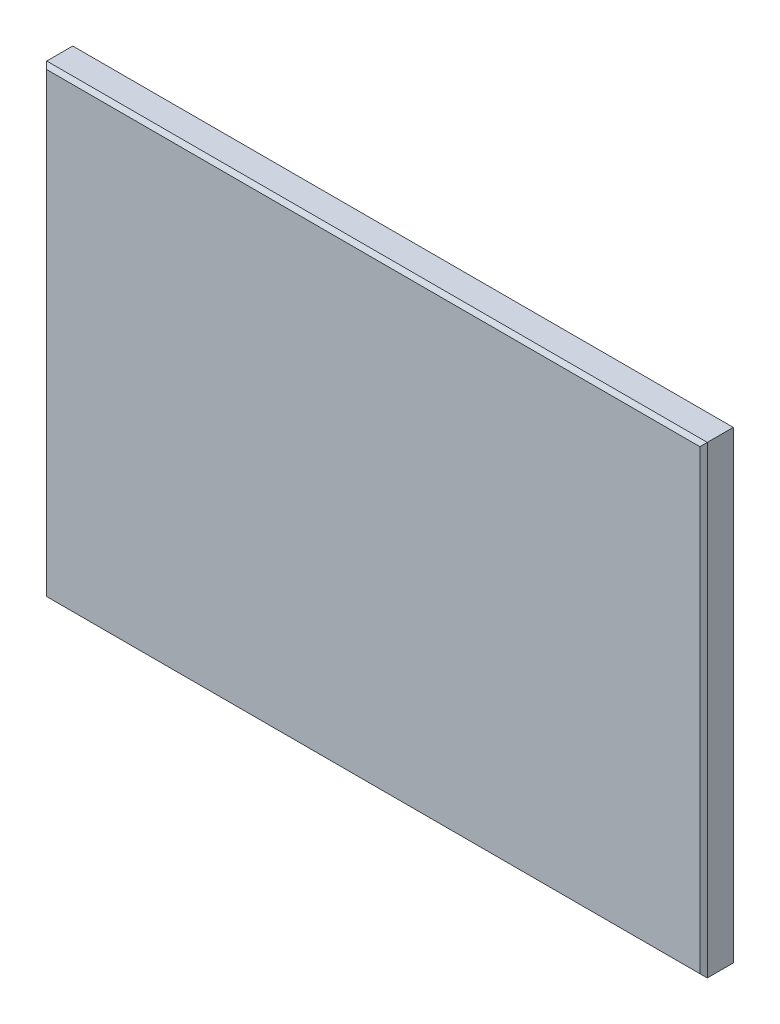
ISO-10303-21;
HEADER;
FILE_DESCRIPTION(('STEP AP214'),'2;1');
FILE_NAME('part.step','',(''),(''),'','','');
FILE_SCHEMA(('AUTOMOTIVE_DESIGN { 1 0 10303 214 1 1 1 1 }'));
ENDSEC;
DATA;
#1=APPLICATION_CONTEXT('core data for automotive mechanical design processes');
#2=APPLICATION_PROTOCOL_DEFINITION('international standard','automotive_design',2000,#1);
#3=PRODUCT_CONTEXT('',#1,'mechanical');
#4=PRODUCT('Part','Part','',(#3));
#5=PRODUCT_RELATED_PRODUCT_CATEGORY('part','',(#4));
#6=PRODUCT_DEFINITION_FORMATION('','',#4);
#7=PRODUCT_DEFINITION_CONTEXT('part definition',#1,'design');
#8=PRODUCT_DEFINITION('design','',#6,#7);
#9=PRODUCT_DEFINITION_SHAPE('','',#8);
#10=(LENGTH_UNIT() NAMED_UNIT(*) SI_UNIT(.MILLI.,.METRE.));
#11=(NAMED_UNIT(*) PLANE_ANGLE_UNIT() SI_UNIT($,.RADIAN.));
#12=(NAMED_UNIT(*) SI_UNIT($,.STERADIAN.) SOLID_ANGLE_UNIT());
#13=UNCERTAINTY_MEASURE_WITH_UNIT(LENGTH_MEASURE(1.E-05),#10,'distance_accuracy_value','');
#14=(GEOMETRIC_REPRESENTATION_CONTEXT(3) GLOBAL_UNCERTAINTY_ASSIGNED_CONTEXT((#13)) GLOBAL_UNIT_ASSIGNED_CONTEXT((#10,
#11,#12)) REPRESENTATION_CONTEXT('',''));
#15=CARTESIAN_POINT('',(0.,0.,0.));
#16=DIRECTION('',(0.,0.,1.));
#17=DIRECTION('',(1.,0.,0.));
#18=AXIS2_PLACEMENT_3D('',#15,#16,#17);
#19=CARTESIAN_POINT('',(-178.,125.,20.));
#20=DIRECTION('',(1.,0.,0.));
#21=DIRECTION('',(0.,1.,0.));
#22=AXIS2_PLACEMENT_3D('',#19,#20,#21);
#23=PLANE('',#22);
#24=DIRECTION('',(0.,0.,-1.));
#25=VECTOR('',#24,1.);
#26=CARTESIAN_POINT('',(-178.,-125.,20.));
#27=LINE('',#26,#25);
#28=CARTESIAN_POINT('',(-178.,-125.,17.9999999999999));
#29=VERTEX_POINT('',#28);
#30=CARTESIAN_POINT('',(-178.,-125.,4.00000000000006));
#31=VERTEX_POINT('',#30);
#32=EDGE_CURVE('E106',#29,#31,#27,.T.);
#33=ORIENTED_EDGE('',*,*,#32,.F.);
#34=DIRECTION('',(0.,1.,0.));
#35=VECTOR('',#34,1.);
#36=CARTESIAN_POINT('',(-178.,125.,17.9999999999999));
#37=LINE('',#36,#35);
#38=CARTESIAN_POINT('',(-178.,125.,17.9999999999999));
#39=VERTEX_POINT('',#38);
#40=EDGE_CURVE('E11',#29,#39,#37,.T.);
#41=ORIENTED_EDGE('',*,*,#40,.T.);
#42=DIRECTION('',(0.,0.,-1.));
#43=VECTOR('',#42,1.);
#44=CARTESIAN_POINT('',(-178.,125.,20.));
#45=LINE('',#44,#43);
#46=CARTESIAN_POINT('',(-178.,125.,4.00000000000006));
#47=VERTEX_POINT('',#46);
#48=EDGE_CURVE('E150',#39,#47,#45,.T.);
#49=ORIENTED_EDGE('',*,*,#48,.T.);
#50=DIRECTION('',(0.,-1.,0.));
#51=VECTOR('',#50,1.);
#52=CARTESIAN_POINT('',(-178.,125.,4.00000000000006));
#53=LINE('',#52,#51);
#54=EDGE_CURVE('E142',#47,#31,#53,.T.);
#55=ORIENTED_EDGE('',*,*,#54,.T.);
#56=EDGE_LOOP('',(#33,#41,#49,#55));
#57=FACE_BOUND('',#56,.T.);
#58=ADVANCED_FACE('F35',(#57),#23,.F.);
#59=CARTESIAN_POINT('',(-178.,-125.,20.));
#60=DIRECTION('',(0.,1.,0.));
#61=DIRECTION('',(0.,0.,1.));
#62=AXIS2_PLACEMENT_3D('',#59,#60,#61);
#63=PLANE('',#62);
#64=DIRECTION('',(0.,0.,-1.));
#65=VECTOR('',#64,1.);
#66=CARTESIAN_POINT('',(178.,-125.,20.));
#67=LINE('',#66,#65);
#68=CARTESIAN_POINT('',(178.,-125.,17.9999999999999));
#69=VERTEX_POINT('',#68);
#70=CARTESIAN_POINT('',(178.,-125.,4.00000000000006));
#71=VERTEX_POINT('',#70);
#72=EDGE_CURVE('E99',#69,#71,#67,.T.);
#73=ORIENTED_EDGE('',*,*,#72,.F.);
#74=DIRECTION('',(-1.,0.,0.));
#75=VECTOR('',#74,1.);
#76=CARTESIAN_POINT('',(-178.,-125.,17.9999999999999));
#77=LINE('',#76,#75);
#78=EDGE_CURVE('E44',#69,#29,#77,.T.);
#79=ORIENTED_EDGE('',*,*,#78,.T.);
#80=ORIENTED_EDGE('',*,*,#32,.T.);
#81=DIRECTION('',(1.,0.,0.));
#82=VECTOR('',#81,1.);
#83=CARTESIAN_POINT('',(-178.,-125.,4.00000000000006));
#84=LINE('',#83,#82);
#85=EDGE_CURVE('E115',#31,#71,#84,.T.);
#86=ORIENTED_EDGE('',*,*,#85,.T.);
#87=EDGE_LOOP('',(#73,#79,#80,#86));
#88=FACE_BOUND('',#87,.T.);
#89=ADVANCED_FACE('F128',(#88),#63,.F.);
#90=CARTESIAN_POINT('',(178.,125.,20.));
#91=DIRECTION('',(-1.,0.,0.));
#92=DIRECTION('',(0.,-1.,0.));
#93=AXIS2_PLACEMENT_3D('',#90,#91,#92);
#94=PLANE('',#93);
#95=DIRECTION('',(0.,0.,-1.));
#96=VECTOR('',#95,1.);
#97=CARTESIAN_POINT('',(178.,125.,20.));
#98=LINE('',#97,#96);
#99=CARTESIAN_POINT('',(178.,125.,17.9999999999999));
#100=VERTEX_POINT('',#99);
#101=CARTESIAN_POINT('',(178.,125.,4.00000000000006));
#102=VERTEX_POINT('',#101);
#103=EDGE_CURVE('E107',#100,#102,#98,.T.);
#104=ORIENTED_EDGE('',*,*,#103,.F.);
#105=DIRECTION('',(0.,-1.,0.));
#106=VECTOR('',#105,1.);
#107=CARTESIAN_POINT('',(178.,-125.,17.9999999999999));
#108=LINE('',#107,#106);
#109=EDGE_CURVE('E59',#100,#69,#108,.T.);
#110=ORIENTED_EDGE('',*,*,#109,.T.);
#111=ORIENTED_EDGE('',*,*,#72,.T.);
#112=DIRECTION('',(0.,1.,0.));
#113=VECTOR('',#112,1.);
#114=CARTESIAN_POINT('',(178.,125.,4.00000000000006));
#115=LINE('',#114,#113);
#116=EDGE_CURVE('E103',#71,#102,#115,.T.);
#117=ORIENTED_EDGE('',*,*,#116,.T.);
#118=EDGE_LOOP('',(#104,#110,#111,#117));
#119=FACE_BOUND('',#118,.T.);
#120=ADVANCED_FACE('F101',(#119),#94,.F.);
#121=CARTESIAN_POINT('',(-178.,125.,20.));
#122=DIRECTION('',(0.,-1.,0.));
#123=DIRECTION('',(0.,0.,-1.));
#124=AXIS2_PLACEMENT_3D('',#121,#122,#123);
#125=PLANE('',#124);
#126=ORIENTED_EDGE('',*,*,#48,.F.);
#127=DIRECTION('',(1.,0.,0.));
#128=VECTOR('',#127,1.);
#129=CARTESIAN_POINT('',(178.,125.,17.9999999999999));
#130=LINE('',#129,#128);
#131=EDGE_CURVE('E159',#39,#100,#130,.T.);
#132=ORIENTED_EDGE('',*,*,#131,.T.);
#133=ORIENTED_EDGE('',*,*,#103,.T.);
#134=DIRECTION('',(-1.,0.,0.));
#135=VECTOR('',#134,1.);
#136=CARTESIAN_POINT('',(-178.,125.,4.00000000000006));
#137=LINE('',#136,#135);
#138=EDGE_CURVE('E126',#102,#47,#137,.T.);
#139=ORIENTED_EDGE('',*,*,#138,.T.);
#140=EDGE_LOOP('',(#126,#132,#133,#139));
#141=FACE_BOUND('',#140,.T.);
#142=ADVANCED_FACE('F187',(#141),#125,.F.);
#143=CARTESIAN_POINT('',(0.,0.,20.));
#144=DIRECTION('',(0.,0.,1.));
#145=DIRECTION('',(1.,0.,0.));
#146=AXIS2_PLACEMENT_3D('',#143,#144,#145);
#147=PLANE('',#146);
#148=DIRECTION('',(0.,1.,0.));
#149=VECTOR('',#148,1.);
#150=CARTESIAN_POINT('',(176.,125.,20.));
#151=LINE('',#150,#149);
#152=CARTESIAN_POINT('',(176.,-123.,20.));
#153=VERTEX_POINT('',#152);
#154=CARTESIAN_POINT('',(176.,123.,20.));
#155=VERTEX_POINT('',#154);
#156=EDGE_CURVE('E154',#153,#155,#151,.T.);
#157=ORIENTED_EDGE('',*,*,#156,.T.);
#158=DIRECTION('',(-1.,0.,0.));
#159=VECTOR('',#158,1.);
#160=CARTESIAN_POINT('',(-178.,123.,20.));
#161=LINE('',#160,#159);
#162=CARTESIAN_POINT('',(-176.,123.,20.));
#163=VERTEX_POINT('',#162);
#164=EDGE_CURVE('E156',#155,#163,#161,.T.);
#165=ORIENTED_EDGE('',*,*,#164,.T.);
#166=DIRECTION('',(0.,-1.,0.));
#167=VECTOR('',#166,1.);
#168=CARTESIAN_POINT('',(-176.,-125.,20.));
#169=LINE('',#168,#167);
#170=CARTESIAN_POINT('',(-176.,-123.,20.));
#171=VERTEX_POINT('',#170);
#172=EDGE_CURVE('E143',#163,#171,#169,.T.);
#173=ORIENTED_EDGE('',*,*,#172,.T.);
#174=DIRECTION('',(1.,0.,0.));
#175=VECTOR('',#174,1.);
#176=CARTESIAN_POINT('',(178.,-123.,20.));
#177=LINE('',#176,#175);
#178=EDGE_CURVE('E152',#171,#153,#177,.T.);
#179=ORIENTED_EDGE('',*,*,#178,.T.);
#180=EDGE_LOOP('',(#157,#165,#173,#179));
#181=FACE_BOUND('',#180,.T.);
#182=ADVANCED_FACE('F194',(#181),#147,.T.);
#183=CARTESIAN_POINT('',(0.,0.,0.));
#184=DIRECTION('',(0.,0.,1.));
#185=DIRECTION('',(1.,0.,0.));
#186=AXIS2_PLACEMENT_3D('',#183,#184,#185);
#187=PLANE('',#186);
#188=DIRECTION('',(0.,-1.,0.));
#189=VECTOR('',#188,1.);
#190=CARTESIAN_POINT('',(174.,0.,0.));
#191=LINE('',#190,#189);
#192=CARTESIAN_POINT('',(174.,121.,0.));
#193=VERTEX_POINT('',#192);
#194=CARTESIAN_POINT('',(174.,-121.,0.));
#195=VERTEX_POINT('',#194);
#196=EDGE_CURVE('E137',#193,#195,#191,.T.);
#197=ORIENTED_EDGE('',*,*,#196,.T.);
#198=DIRECTION('',(-1.,0.,0.));
#199=VECTOR('',#198,1.);
#200=CARTESIAN_POINT('',(0.,-121.,0.));
#201=LINE('',#200,#199);
#202=CARTESIAN_POINT('',(-174.,-121.,0.));
#203=VERTEX_POINT('',#202);
#204=EDGE_CURVE('E117',#195,#203,#201,.T.);
#205=ORIENTED_EDGE('',*,*,#204,.T.);
#206=DIRECTION('',(0.,1.,0.));
#207=VECTOR('',#206,1.);
#208=CARTESIAN_POINT('',(-174.,0.,0.));
#209=LINE('',#208,#207);
#210=CARTESIAN_POINT('',(-174.,121.,0.));
#211=VERTEX_POINT('',#210);
#212=EDGE_CURVE('E130',#203,#211,#209,.T.);
#213=ORIENTED_EDGE('',*,*,#212,.T.);
#214=DIRECTION('',(1.,0.,0.));
#215=VECTOR('',#214,1.);
#216=CARTESIAN_POINT('',(0.,121.,0.));
#217=LINE('',#216,#215);
#218=EDGE_CURVE('E132',#211,#193,#217,.T.);
#219=ORIENTED_EDGE('',*,*,#218,.T.);
#220=EDGE_LOOP('',(#197,#205,#213,#219));
#221=FACE_BOUND('',#220,.T.);
#222=ADVANCED_FACE('F196',(#221),#187,.F.);
#223=CARTESIAN_POINT('',(-178.,125.,4.00000000000006));
#224=DIRECTION('',(0.,-0.707106781186547,0.707106781186547));
#225=DIRECTION('',(-1.,0.,0.));
#226=AXIS2_PLACEMENT_3D('',#223,#224,#225);
#227=PLANE('',#226);
#228=DIRECTION('',(-0.577350269189626,-0.577350269189626,-0.577350269189626));
#229=VECTOR('',#228,1.);
#230=CARTESIAN_POINT('',(59.3333333333333,6.33333333333334,-114.666666666667));
#231=LINE('',#230,#229);
#232=EDGE_CURVE('E125',#193,#102,#231,.F.);
#233=ORIENTED_EDGE('',*,*,#232,.F.);
#234=ORIENTED_EDGE('',*,*,#218,.F.);
#235=DIRECTION('',(0.577350269189627,-0.577350269189625,-0.577350269189625));
#236=VECTOR('',#235,1.);
#237=CARTESIAN_POINT('',(-178.,125.,4.00000000000006));
#238=LINE('',#237,#236);
#239=EDGE_CURVE('E147',#47,#211,#238,.T.);
#240=ORIENTED_EDGE('',*,*,#239,.F.);
#241=ORIENTED_EDGE('',*,*,#138,.F.);
#242=EDGE_LOOP('',(#233,#234,#240,#241));
#243=FACE_BOUND('',#242,.T.);
#244=ADVANCED_FACE('F203',(#243),#227,.F.);
#245=CARTESIAN_POINT('',(-178.,125.,4.00000000000006));
#246=DIRECTION('',(0.707106781186546,0.,0.707106781186549));
#247=DIRECTION('',(0.,-1.,0.));
#248=AXIS2_PLACEMENT_3D('',#245,#246,#247);
#249=PLANE('',#248);
#250=ORIENTED_EDGE('',*,*,#239,.T.);
#251=ORIENTED_EDGE('',*,*,#212,.F.);
#252=DIRECTION('',(-0.577350269189627,-0.577350269189625,0.577350269189625));
#253=VECTOR('',#252,1.);
#254=CARTESIAN_POINT('',(-94.6666666666666,-41.6666666666668,-79.3333333333331));
#255=LINE('',#254,#253);
#256=EDGE_CURVE('E120',#31,#203,#255,.F.);
#257=ORIENTED_EDGE('',*,*,#256,.F.);
#258=ORIENTED_EDGE('',*,*,#54,.F.);
#259=EDGE_LOOP('',(#250,#251,#257,#258));
#260=FACE_BOUND('',#259,.T.);
#261=ADVANCED_FACE('F220',(#260),#249,.F.);
#262=CARTESIAN_POINT('',(178.,125.,4.00000000000006));
#263=DIRECTION('',(-0.707106781186547,0.,0.707106781186547));
#264=DIRECTION('',(0.,1.,0.));
#265=AXIS2_PLACEMENT_3D('',#262,#263,#264);
#266=PLANE('',#265);
#267=ORIENTED_EDGE('',*,*,#232,.T.);
#268=ORIENTED_EDGE('',*,*,#116,.F.);
#269=DIRECTION('',(-0.577350269189626,0.577350269189626,-0.577350269189626));
#270=VECTOR('',#269,1.);
#271=CARTESIAN_POINT('',(94.6666666666667,-41.6666666666667,-79.3333333333333));
#272=LINE('',#271,#270);
#273=EDGE_CURVE('E113',#195,#71,#272,.F.);
#274=ORIENTED_EDGE('',*,*,#273,.F.);
#275=ORIENTED_EDGE('',*,*,#196,.F.);
#276=EDGE_LOOP('',(#267,#268,#274,#275));
#277=FACE_BOUND('',#276,.T.);
#278=ADVANCED_FACE('F123',(#277),#266,.F.);
#279=CARTESIAN_POINT('',(-178.,-125.,4.00000000000006));
#280=DIRECTION('',(0.,0.707106781186547,0.707106781186547));
#281=DIRECTION('',(1.,0.,0.));
#282=AXIS2_PLACEMENT_3D('',#279,#280,#281);
#283=PLANE('',#282);
#284=ORIENTED_EDGE('',*,*,#256,.T.);
#285=ORIENTED_EDGE('',*,*,#204,.F.);
#286=ORIENTED_EDGE('',*,*,#273,.T.);
#287=ORIENTED_EDGE('',*,*,#85,.F.);
#288=EDGE_LOOP('',(#284,#285,#286,#287));
#289=FACE_BOUND('',#288,.T.);
#290=ADVANCED_FACE('F114',(#289),#283,.F.);
#291=CARTESIAN_POINT('',(0.,-123.,20.));
#292=DIRECTION('',(0.,-0.707106781186548,0.707106781186548));
#293=DIRECTION('',(-1.,0.,0.));
#294=AXIS2_PLACEMENT_3D('',#291,#292,#293);
#295=PLANE('',#294);
#296=DIRECTION('',(0.577350269189629,0.577350269189624,0.577350269189624));
#297=VECTOR('',#296,1.);
#298=CARTESIAN_POINT('',(-135.,-82.0000000000002,60.9999999999998));
#299=LINE('',#298,#297);
#300=EDGE_CURVE('E167',#29,#171,#299,.T.);
#301=ORIENTED_EDGE('',*,*,#300,.F.);
#302=ORIENTED_EDGE('',*,*,#78,.F.);
#303=DIRECTION('',(-0.577350269189626,0.577350269189626,0.577350269189626));
#304=VECTOR('',#303,1.);
#305=CARTESIAN_POINT('',(117.333333333333,-64.3333333333333,78.6666666666666));
#306=LINE('',#305,#304);
#307=EDGE_CURVE('E39',#153,#69,#306,.F.);
#308=ORIENTED_EDGE('',*,*,#307,.F.);
#309=ORIENTED_EDGE('',*,*,#178,.F.);
#310=EDGE_LOOP('',(#301,#302,#308,#309));
#311=FACE_BOUND('',#310,.T.);
#312=ADVANCED_FACE('F37',(#311),#295,.T.);
#313=CARTESIAN_POINT('',(176.,0.,20.));
#314=DIRECTION('',(0.707106781186548,0.,0.707106781186548));
#315=DIRECTION('',(0.,-1.,0.));
#316=AXIS2_PLACEMENT_3D('',#313,#314,#315);
#317=PLANE('',#316);
#318=ORIENTED_EDGE('',*,*,#307,.T.);
#319=ORIENTED_EDGE('',*,*,#109,.F.);
#320=DIRECTION('',(-0.577350269189626,-0.577350269189626,0.577350269189626));
#321=VECTOR('',#320,1.);
#322=CARTESIAN_POINT('',(135.,82.,61.));
#323=LINE('',#322,#321);
#324=EDGE_CURVE('E166',#155,#100,#323,.F.);
#325=ORIENTED_EDGE('',*,*,#324,.F.);
#326=ORIENTED_EDGE('',*,*,#156,.F.);
#327=EDGE_LOOP('',(#318,#319,#325,#326));
#328=FACE_BOUND('',#327,.T.);
#329=ADVANCED_FACE('F177',(#328),#317,.T.);
#330=CARTESIAN_POINT('',(-176.,0.,20.));
#331=DIRECTION('',(-0.707106781186545,0.,0.70710678118655));
#332=DIRECTION('',(0.,1.,0.));
#333=AXIS2_PLACEMENT_3D('',#330,#331,#332);
#334=PLANE('',#333);
#335=ORIENTED_EDGE('',*,*,#300,.T.);
#336=ORIENTED_EDGE('',*,*,#172,.F.);
#337=DIRECTION('',(-0.577350269189629,0.577350269189624,-0.577350269189624));
#338=VECTOR('',#337,1.);
#339=CARTESIAN_POINT('',(-135.,82.0000000000001,60.9999999999998));
#340=LINE('',#339,#338);
#341=EDGE_CURVE('E164',#39,#163,#340,.F.);
#342=ORIENTED_EDGE('',*,*,#341,.F.);
#343=ORIENTED_EDGE('',*,*,#40,.F.);
#344=EDGE_LOOP('',(#335,#336,#342,#343));
#345=FACE_BOUND('',#344,.T.);
#346=ADVANCED_FACE('F182',(#345),#334,.T.);
#347=CARTESIAN_POINT('',(0.,123.,20.));
#348=DIRECTION('',(0.,0.707106781186548,0.707106781186548));
#349=DIRECTION('',(1.,0.,0.));
#350=AXIS2_PLACEMENT_3D('',#347,#348,#349);
#351=PLANE('',#350);
#352=ORIENTED_EDGE('',*,*,#324,.T.);
#353=ORIENTED_EDGE('',*,*,#131,.F.);
#354=ORIENTED_EDGE('',*,*,#341,.T.);
#355=ORIENTED_EDGE('',*,*,#164,.F.);
#356=EDGE_LOOP('',(#352,#353,#354,#355));
#357=FACE_BOUND('',#356,.T.);
#358=ADVANCED_FACE('F191',(#357),#351,.T.);
#359=CLOSED_SHELL('',(#58,#89,#120,#142,#182,#222,#244,#261,#278,#290,#312,#329,#346,#358));
#360=MANIFOLD_SOLID_BREP('B2',#359);
#361=ADVANCED_BREP_SHAPE_REPRESENTATION('',(#18,#360),#14);
#362=SHAPE_DEFINITION_REPRESENTATION(#9,#361);
ENDSEC;
END-ISO-10303-21;
